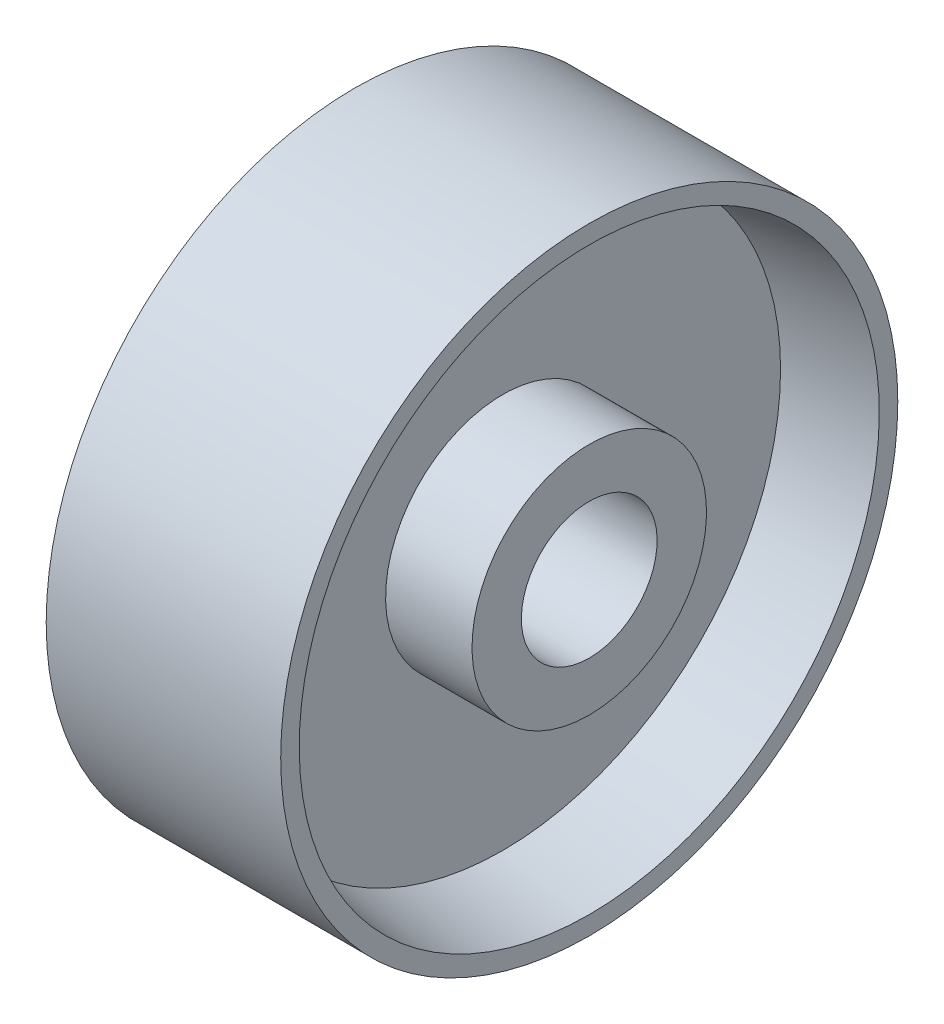
ISO-10303-21;
HEADER;
FILE_DESCRIPTION(('STEP AP214'),'2;1');
FILE_NAME('part.step','',(''),(''),'','','');
FILE_SCHEMA(('AUTOMOTIVE_DESIGN { 1 0 10303 214 1 1 1 1 }'));
ENDSEC;
DATA;
#1=APPLICATION_CONTEXT('core data for automotive mechanical design processes');
#2=APPLICATION_PROTOCOL_DEFINITION('international standard','automotive_design',2000,#1);
#3=PRODUCT_CONTEXT('',#1,'mechanical');
#4=PRODUCT('Part','Part','',(#3));
#5=PRODUCT_RELATED_PRODUCT_CATEGORY('part','',(#4));
#6=PRODUCT_DEFINITION_FORMATION('','',#4);
#7=PRODUCT_DEFINITION_CONTEXT('part definition',#1,'design');
#8=PRODUCT_DEFINITION('design','',#6,#7);
#9=PRODUCT_DEFINITION_SHAPE('','',#8);
#10=(LENGTH_UNIT() NAMED_UNIT(*) SI_UNIT(.MILLI.,.METRE.));
#11=(NAMED_UNIT(*) PLANE_ANGLE_UNIT() SI_UNIT($,.RADIAN.));
#12=(NAMED_UNIT(*) SI_UNIT($,.STERADIAN.) SOLID_ANGLE_UNIT());
#13=UNCERTAINTY_MEASURE_WITH_UNIT(LENGTH_MEASURE(1.E-05),#10,'distance_accuracy_value','');
#14=(GEOMETRIC_REPRESENTATION_CONTEXT(3) GLOBAL_UNCERTAINTY_ASSIGNED_CONTEXT((#13)) GLOBAL_UNIT_ASSIGNED_CONTEXT((#10,
#11,#12)) REPRESENTATION_CONTEXT('',''));
#15=CARTESIAN_POINT('',(0.,0.,0.));
#16=DIRECTION('',(0.,0.,1.));
#17=DIRECTION('',(1.,0.,0.));
#18=AXIS2_PLACEMENT_3D('',#15,#16,#17);
#19=CARTESIAN_POINT('',(19.,-18.9999999999999,0.));
#20=DIRECTION('',(1.,0.,0.));
#21=DIRECTION('',(0.,1.,0.));
#22=AXIS2_PLACEMENT_3D('',#19,#20,#21);
#23=PLANE('',#22);
#24=CARTESIAN_POINT('',(19.,4.02455846426619E-13,0.));
#25=DIRECTION('',(-1.,0.,0.));
#26=DIRECTION('',(0.,-1.,0.));
#27=AXIS2_PLACEMENT_3D('',#24,#25,#26);
#28=CIRCLE('',#27,11.);
#29=CARTESIAN_POINT('',(19.,-10.9999999999996,0.));
#30=VERTEX_POINT('',#29);
#31=EDGE_CURVE('E10',#30,#30,#28,.T.);
#32=ORIENTED_EDGE('',*,*,#31,.T.);
#33=EDGE_LOOP('',(#32));
#34=FACE_BOUND('',#33,.T.);
#35=CARTESIAN_POINT('',(19.,4.02455846426619E-13,0.));
#36=DIRECTION('',(-1.,0.,0.));
#37=DIRECTION('',(0.,-1.,0.));
#38=AXIS2_PLACEMENT_3D('',#35,#36,#37);
#39=CIRCLE('',#38,19.);
#40=CARTESIAN_POINT('',(19.,-18.9999999999996,0.));
#41=VERTEX_POINT('',#40);
#42=EDGE_CURVE('E68',#41,#41,#39,.T.);
#43=ORIENTED_EDGE('',*,*,#42,.F.);
#44=EDGE_LOOP('',(#43));
#45=FACE_BOUND('',#44,.T.);
#46=ADVANCED_FACE('F28',(#34,#45),#23,.T.);
#47=CARTESIAN_POINT('',(-25.,1.94289029309402E-13,0.));
#48=DIRECTION('',(-1.,0.,0.));
#49=DIRECTION('',(0.,-1.,0.));
#50=AXIS2_PLACEMENT_3D('',#47,#48,#49);
#51=CYLINDRICAL_SURFACE('',#50,11.);
#52=CARTESIAN_POINT('',(-19.,2.08166817117217E-13,0.));
#53=DIRECTION('',(-1.,0.,0.));
#54=DIRECTION('',(0.,-1.,0.));
#55=AXIS2_PLACEMENT_3D('',#52,#53,#54);
#56=CIRCLE('',#55,11.);
#57=CARTESIAN_POINT('',(-19.,-10.9999999999998,0.));
#58=VERTEX_POINT('',#57);
#59=EDGE_CURVE('E34',#58,#58,#56,.T.);
#60=ORIENTED_EDGE('',*,*,#59,.T.);
#61=EDGE_LOOP('',(#60));
#62=FACE_BOUND('',#61,.T.);
#63=ORIENTED_EDGE('',*,*,#31,.F.);
#64=EDGE_LOOP('',(#63));
#65=FACE_BOUND('',#64,.T.);
#66=ADVANCED_FACE('F76',(#62,#65),#51,.F.);
#67=CARTESIAN_POINT('',(-19.,-10.9999999999996,0.));
#68=DIRECTION('',(-1.,0.,0.));
#69=DIRECTION('',(0.,-1.,0.));
#70=AXIS2_PLACEMENT_3D('',#67,#68,#69);
#71=PLANE('',#70);
#72=CARTESIAN_POINT('',(-19.,2.08166817117217E-13,0.));
#73=DIRECTION('',(-1.,0.,0.));
#74=DIRECTION('',(0.,-1.,0.));
#75=AXIS2_PLACEMENT_3D('',#72,#73,#74);
#76=CIRCLE('',#75,19.);
#77=CARTESIAN_POINT('',(-19.,-18.9999999999998,0.));
#78=VERTEX_POINT('',#77);
#79=EDGE_CURVE('E38',#78,#78,#76,.T.);
#80=ORIENTED_EDGE('',*,*,#79,.T.);
#81=EDGE_LOOP('',(#80));
#82=FACE_BOUND('',#81,.T.);
#83=ORIENTED_EDGE('',*,*,#59,.F.);
#84=EDGE_LOOP('',(#83));
#85=FACE_BOUND('',#84,.T.);
#86=ADVANCED_FACE('F80',(#82,#85),#71,.T.);
#87=CARTESIAN_POINT('',(-25.,1.94289029309402E-13,0.));
#88=DIRECTION('',(-1.,0.,0.));
#89=DIRECTION('',(0.,-1.,0.));
#90=AXIS2_PLACEMENT_3D('',#87,#88,#89);
#91=CYLINDRICAL_SURFACE('',#90,19.);
#92=CARTESIAN_POINT('',(-5.,1.66533453693773E-13,0.));
#93=DIRECTION('',(-1.,0.,0.));
#94=DIRECTION('',(0.,-1.,0.));
#95=AXIS2_PLACEMENT_3D('',#92,#93,#94);
#96=CIRCLE('',#95,19.);
#97=CARTESIAN_POINT('',(-5.,-18.9999999999998,0.));
#98=VERTEX_POINT('',#97);
#99=EDGE_CURVE('E42',#98,#98,#96,.T.);
#100=ORIENTED_EDGE('',*,*,#99,.T.);
#101=EDGE_LOOP('',(#100));
#102=FACE_BOUND('',#101,.T.);
#103=ORIENTED_EDGE('',*,*,#79,.F.);
#104=EDGE_LOOP('',(#103));
#105=FACE_BOUND('',#104,.T.);
#106=ADVANCED_FACE('F84',(#102,#105),#91,.T.);
#107=CARTESIAN_POINT('',(-5.,-18.9999999999995,0.));
#108=DIRECTION('',(-1.,0.,0.));
#109=DIRECTION('',(0.,-1.,0.));
#110=AXIS2_PLACEMENT_3D('',#107,#108,#109);
#111=PLANE('',#110);
#112=CARTESIAN_POINT('',(-5.,1.66533453693773E-13,0.));
#113=DIRECTION('',(-1.,0.,0.));
#114=DIRECTION('',(0.,-1.,0.));
#115=AXIS2_PLACEMENT_3D('',#112,#113,#114);
#116=CIRCLE('',#115,45.);
#117=CARTESIAN_POINT('',(-4.99999999999999,-44.9999999999998,0.));
#118=VERTEX_POINT('',#117);
#119=EDGE_CURVE('E47',#118,#118,#116,.T.);
#120=ORIENTED_EDGE('',*,*,#119,.T.);
#121=EDGE_LOOP('',(#120));
#122=FACE_BOUND('',#121,.T.);
#123=ORIENTED_EDGE('',*,*,#99,.F.);
#124=EDGE_LOOP('',(#123));
#125=FACE_BOUND('',#124,.T.);
#126=ADVANCED_FACE('F91',(#122,#125),#111,.T.);
#127=CARTESIAN_POINT('',(-5.,1.66533453693773E-13,0.));
#128=DIRECTION('',(-1.,0.,0.));
#129=DIRECTION('',(0.,-1.,0.));
#130=AXIS2_PLACEMENT_3D('',#127,#128,#129);
#131=CONICAL_SURFACE('',#130,45.,0.141897054604164);
#132=CARTESIAN_POINT('',(-19.,2.08166817117217E-13,0.));
#133=DIRECTION('',(-1.,0.,0.));
#134=DIRECTION('',(0.,-1.,0.));
#135=AXIS2_PLACEMENT_3D('',#132,#133,#134);
#136=CIRCLE('',#135,47.);
#137=CARTESIAN_POINT('',(-19.,-46.9999999999998,0.));
#138=VERTEX_POINT('',#137);
#139=EDGE_CURVE('E50',#138,#138,#136,.T.);
#140=ORIENTED_EDGE('',*,*,#139,.T.);
#141=EDGE_LOOP('',(#140));
#142=FACE_BOUND('',#141,.T.);
#143=ORIENTED_EDGE('',*,*,#119,.F.);
#144=EDGE_LOOP('',(#143));
#145=FACE_BOUND('',#144,.T.);
#146=ADVANCED_FACE('F95',(#142,#145),#131,.F.);
#147=CARTESIAN_POINT('',(-19.,-46.9999999999995,0.));
#148=DIRECTION('',(-1.,0.,0.));
#149=DIRECTION('',(0.,-1.,0.));
#150=AXIS2_PLACEMENT_3D('',#147,#148,#149);
#151=PLANE('',#150);
#152=CARTESIAN_POINT('',(-19.,2.08166817117217E-13,0.));
#153=DIRECTION('',(-1.,0.,0.));
#154=DIRECTION('',(0.,-1.,0.));
#155=AXIS2_PLACEMENT_3D('',#152,#153,#154);
#156=CIRCLE('',#155,50.);
#157=CARTESIAN_POINT('',(-19.,-49.9999999999998,0.));
#158=VERTEX_POINT('',#157);
#159=EDGE_CURVE('E53',#158,#158,#156,.T.);
#160=ORIENTED_EDGE('',*,*,#159,.T.);
#161=EDGE_LOOP('',(#160));
#162=FACE_BOUND('',#161,.T.);
#163=ORIENTED_EDGE('',*,*,#139,.F.);
#164=EDGE_LOOP('',(#163));
#165=FACE_BOUND('',#164,.T.);
#166=ADVANCED_FACE('F99',(#162,#165),#151,.T.);
#167=CARTESIAN_POINT('',(-25.,1.94289029309402E-13,0.));
#168=DIRECTION('',(-1.,0.,0.));
#169=DIRECTION('',(0.,-1.,0.));
#170=AXIS2_PLACEMENT_3D('',#167,#168,#169);
#171=CYLINDRICAL_SURFACE('',#170,50.);
#172=CARTESIAN_POINT('',(19.,4.02455846426619E-13,0.));
#173=DIRECTION('',(-1.,0.,0.));
#174=DIRECTION('',(0.,-1.,0.));
#175=AXIS2_PLACEMENT_3D('',#172,#173,#174);
#176=CIRCLE('',#175,50.);
#177=CARTESIAN_POINT('',(19.,-49.9999999999996,0.));
#178=VERTEX_POINT('',#177);
#179=EDGE_CURVE('E56',#178,#178,#176,.T.);
#180=ORIENTED_EDGE('',*,*,#179,.T.);
#181=EDGE_LOOP('',(#180));
#182=FACE_BOUND('',#181,.T.);
#183=ORIENTED_EDGE('',*,*,#159,.F.);
#184=EDGE_LOOP('',(#183));
#185=FACE_BOUND('',#184,.T.);
#186=ADVANCED_FACE('F103',(#182,#185),#171,.T.);
#187=CARTESIAN_POINT('',(19.,-49.9999999999996,0.));
#188=DIRECTION('',(1.,0.,0.));
#189=DIRECTION('',(0.,1.,0.));
#190=AXIS2_PLACEMENT_3D('',#187,#188,#189);
#191=PLANE('',#190);
#192=CARTESIAN_POINT('',(19.,4.02455846426619E-13,0.));
#193=DIRECTION('',(-1.,0.,0.));
#194=DIRECTION('',(0.,-1.,0.));
#195=AXIS2_PLACEMENT_3D('',#192,#193,#194);
#196=CIRCLE('',#195,47.);
#197=CARTESIAN_POINT('',(19.,-46.9999999999996,0.));
#198=VERTEX_POINT('',#197);
#199=EDGE_CURVE('E59',#198,#198,#196,.T.);
#200=ORIENTED_EDGE('',*,*,#199,.T.);
#201=EDGE_LOOP('',(#200));
#202=FACE_BOUND('',#201,.T.);
#203=ORIENTED_EDGE('',*,*,#179,.F.);
#204=EDGE_LOOP('',(#203));
#205=FACE_BOUND('',#204,.T.);
#206=ADVANCED_FACE('F107',(#202,#205),#191,.T.);
#207=CARTESIAN_POINT('',(19.,4.02455846426619E-13,0.));
#208=DIRECTION('',(1.,0.,0.));
#209=DIRECTION('',(0.,1.,0.));
#210=AXIS2_PLACEMENT_3D('',#207,#208,#209);
#211=CONICAL_SURFACE('',#210,47.,0.141897054604164);
#212=CARTESIAN_POINT('',(4.99999999999999,1.66533453693773E-13,0.));
#213=DIRECTION('',(-1.,0.,0.));
#214=DIRECTION('',(0.,-1.,0.));
#215=AXIS2_PLACEMENT_3D('',#212,#213,#214);
#216=CIRCLE('',#215,45.);
#217=CARTESIAN_POINT('',(5.,-44.9999999999998,0.));
#218=VERTEX_POINT('',#217);
#219=EDGE_CURVE('E62',#218,#218,#216,.T.);
#220=ORIENTED_EDGE('',*,*,#219,.T.);
#221=EDGE_LOOP('',(#220));
#222=FACE_BOUND('',#221,.T.);
#223=ORIENTED_EDGE('',*,*,#199,.F.);
#224=EDGE_LOOP('',(#223));
#225=FACE_BOUND('',#224,.T.);
#226=ADVANCED_FACE('F111',(#222,#225),#211,.F.);
#227=CARTESIAN_POINT('',(4.99999999999997,-44.9999999999995,0.));
#228=DIRECTION('',(1.,0.,0.));
#229=DIRECTION('',(0.,1.,0.));
#230=AXIS2_PLACEMENT_3D('',#227,#228,#229);
#231=PLANE('',#230);
#232=CARTESIAN_POINT('',(5.,1.66533453693773E-13,0.));
#233=DIRECTION('',(-1.,0.,0.));
#234=DIRECTION('',(0.,-1.,0.));
#235=AXIS2_PLACEMENT_3D('',#232,#233,#234);
#236=CIRCLE('',#235,19.);
#237=CARTESIAN_POINT('',(5.,-18.9999999999998,0.));
#238=VERTEX_POINT('',#237);
#239=EDGE_CURVE('E65',#238,#238,#236,.T.);
#240=ORIENTED_EDGE('',*,*,#239,.T.);
#241=EDGE_LOOP('',(#240));
#242=FACE_BOUND('',#241,.T.);
#243=ORIENTED_EDGE('',*,*,#219,.F.);
#244=EDGE_LOOP('',(#243));
#245=FACE_BOUND('',#244,.T.);
#246=ADVANCED_FACE('F115',(#242,#245),#231,.T.);
#247=CARTESIAN_POINT('',(-25.,1.94289029309402E-13,0.));
#248=DIRECTION('',(-1.,0.,0.));
#249=DIRECTION('',(0.,-1.,0.));
#250=AXIS2_PLACEMENT_3D('',#247,#248,#249);
#251=CYLINDRICAL_SURFACE('',#250,19.);
#252=ORIENTED_EDGE('',*,*,#42,.T.);
#253=EDGE_LOOP('',(#252));
#254=FACE_BOUND('',#253,.T.);
#255=ORIENTED_EDGE('',*,*,#239,.F.);
#256=EDGE_LOOP('',(#255));
#257=FACE_BOUND('',#256,.T.);
#258=ADVANCED_FACE('F72',(#254,#257),#251,.T.);
#259=CLOSED_SHELL('',(#46,#66,#86,#106,#126,#146,#166,#186,#206,#226,#246,#258));
#260=MANIFOLD_SOLID_BREP('B2',#259);
#261=ADVANCED_BREP_SHAPE_REPRESENTATION('',(#18,#260),#14);
#262=SHAPE_DEFINITION_REPRESENTATION(#9,#261);
ENDSEC;
END-ISO-10303-21;
